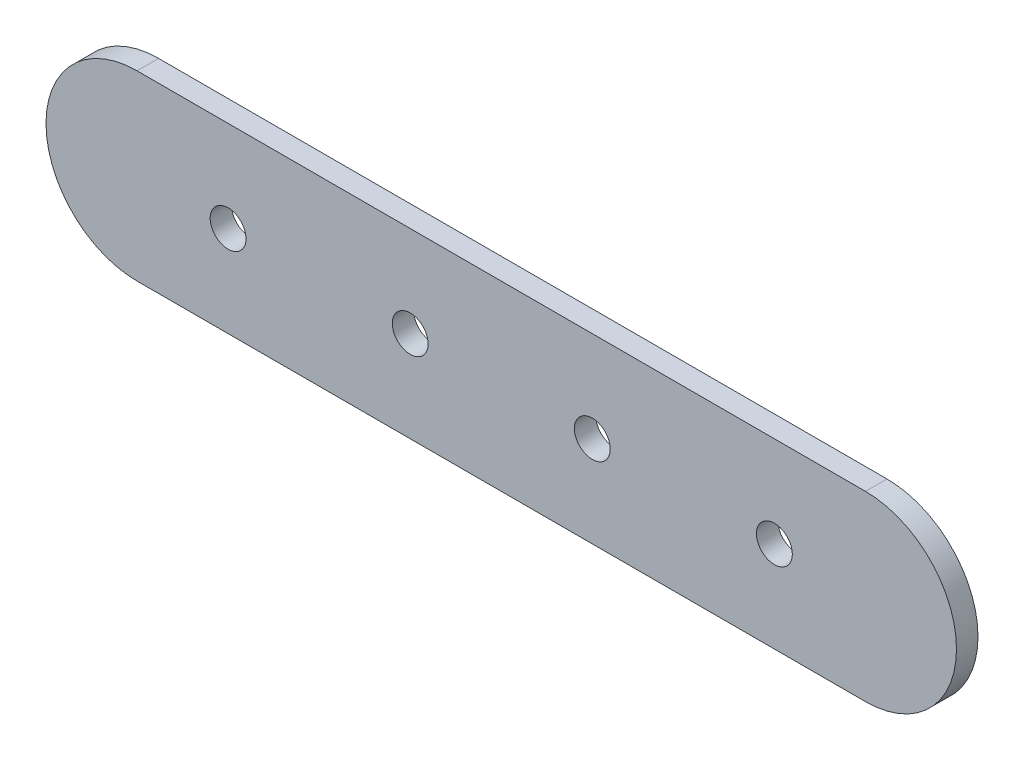
ISO-10303-21;
HEADER;
FILE_DESCRIPTION(('STEP AP214'),'2;1');
FILE_NAME('part.step','',(''),(''),'','','');
FILE_SCHEMA(('AUTOMOTIVE_DESIGN { 1 0 10303 214 1 1 1 1 }'));
ENDSEC;
DATA;
#1=APPLICATION_CONTEXT('core data for automotive mechanical design processes');
#2=APPLICATION_PROTOCOL_DEFINITION('international standard','automotive_design',2000,#1);
#3=PRODUCT_CONTEXT('',#1,'mechanical');
#4=PRODUCT('Part','Part','',(#3));
#5=PRODUCT_RELATED_PRODUCT_CATEGORY('part','',(#4));
#6=PRODUCT_DEFINITION_FORMATION('','',#4);
#7=PRODUCT_DEFINITION_CONTEXT('part definition',#1,'design');
#8=PRODUCT_DEFINITION('design','',#6,#7);
#9=PRODUCT_DEFINITION_SHAPE('','',#8);
#10=(LENGTH_UNIT() NAMED_UNIT(*) SI_UNIT(.MILLI.,.METRE.));
#11=(NAMED_UNIT(*) PLANE_ANGLE_UNIT() SI_UNIT($,.RADIAN.));
#12=(NAMED_UNIT(*) SI_UNIT($,.STERADIAN.) SOLID_ANGLE_UNIT());
#13=UNCERTAINTY_MEASURE_WITH_UNIT(LENGTH_MEASURE(1.E-05),#10,'distance_accuracy_value','');
#14=(GEOMETRIC_REPRESENTATION_CONTEXT(3) GLOBAL_UNCERTAINTY_ASSIGNED_CONTEXT((#13)) GLOBAL_UNIT_ASSIGNED_CONTEXT((#10,
#11,#12)) REPRESENTATION_CONTEXT('',''));
#15=CARTESIAN_POINT('',(0.,0.,0.));
#16=DIRECTION('',(0.,0.,1.));
#17=DIRECTION('',(1.,0.,0.));
#18=AXIS2_PLACEMENT_3D('',#15,#16,#17);
#19=CARTESIAN_POINT('',(-494.678321678322,0.,30.));
#20=DIRECTION('',(0.,0.,1.));
#21=DIRECTION('',(1.,0.,0.));
#22=AXIS2_PLACEMENT_3D('',#19,#20,#21);
#23=PLANE('',#22);
#24=CARTESIAN_POINT('',(140.321678321678,0.,30.));
#25=DIRECTION('',(0.,0.,1.));
#26=DIRECTION('',(1.,0.,0.));
#27=AXIS2_PLACEMENT_3D('',#24,#25,#26);
#28=CIRCLE('',#27,25.);
#29=CARTESIAN_POINT('',(165.321678321678,0.,30.));
#30=VERTEX_POINT('',#29);
#31=EDGE_CURVE('E142',#30,#30,#28,.T.);
#32=ORIENTED_EDGE('',*,*,#31,.F.);
#33=EDGE_LOOP('',(#32));
#34=FACE_BOUND('',#33,.T.);
#35=CARTESIAN_POINT('',(-367.678321678322,0.,30.));
#36=DIRECTION('',(0.,0.,1.));
#37=DIRECTION('',(1.,0.,0.));
#38=AXIS2_PLACEMENT_3D('',#35,#36,#37);
#39=CIRCLE('',#38,25.);
#40=CARTESIAN_POINT('',(-342.678321678322,0.,30.));
#41=VERTEX_POINT('',#40);
#42=EDGE_CURVE('E112',#41,#41,#39,.T.);
#43=ORIENTED_EDGE('',*,*,#42,.F.);
#44=EDGE_LOOP('',(#43));
#45=FACE_BOUND('',#44,.T.);
#46=CARTESIAN_POINT('',(-494.678321678322,0.,30.));
#47=DIRECTION('',(0.,0.,1.));
#48=DIRECTION('',(1.,0.,0.));
#49=AXIS2_PLACEMENT_3D('',#46,#47,#48);
#50=CIRCLE('',#49,127.);
#51=CARTESIAN_POINT('',(-494.678321678322,127.,30.));
#52=VERTEX_POINT('',#51);
#53=CARTESIAN_POINT('',(-494.678321678322,-127.,30.));
#54=VERTEX_POINT('',#53);
#55=EDGE_CURVE('E92',#52,#54,#50,.T.);
#56=ORIENTED_EDGE('',*,*,#55,.T.);
#57=DIRECTION('',(1.,0.,0.));
#58=VECTOR('',#57,1.);
#59=CARTESIAN_POINT('',(-494.678321678322,-127.,30.));
#60=LINE('',#59,#58);
#61=CARTESIAN_POINT('',(521.321678321678,-127.,30.));
#62=VERTEX_POINT('',#61);
#63=EDGE_CURVE('E87',#54,#62,#60,.T.);
#64=ORIENTED_EDGE('',*,*,#63,.T.);
#65=CARTESIAN_POINT('',(521.321678321678,0.,30.));
#66=DIRECTION('',(0.,0.,1.));
#67=DIRECTION('',(1.,0.,0.));
#68=AXIS2_PLACEMENT_3D('',#65,#66,#67);
#69=CIRCLE('',#68,127.);
#70=CARTESIAN_POINT('',(521.321678321678,127.,30.));
#71=VERTEX_POINT('',#70);
#72=EDGE_CURVE('E90',#62,#71,#69,.T.);
#73=ORIENTED_EDGE('',*,*,#72,.T.);
#74=DIRECTION('',(-1.,0.,0.));
#75=VECTOR('',#74,1.);
#76=CARTESIAN_POINT('',(-494.678321678322,127.,30.));
#77=LINE('',#76,#75);
#78=EDGE_CURVE('E57',#71,#52,#77,.T.);
#79=ORIENTED_EDGE('',*,*,#78,.T.);
#80=EDGE_LOOP('',(#56,#64,#73,#79));
#81=FACE_BOUND('',#80,.T.);
#82=CARTESIAN_POINT('',(-113.678321678322,0.,30.));
#83=DIRECTION('',(0.,0.,1.));
#84=DIRECTION('',(1.,0.,0.));
#85=AXIS2_PLACEMENT_3D('',#82,#83,#84);
#86=CIRCLE('',#85,25.);
#87=CARTESIAN_POINT('',(-88.6783216783217,0.,30.));
#88=VERTEX_POINT('',#87);
#89=EDGE_CURVE('E134',#88,#88,#86,.T.);
#90=ORIENTED_EDGE('',*,*,#89,.F.);
#91=EDGE_LOOP('',(#90));
#92=FACE_BOUND('',#91,.T.);
#93=CARTESIAN_POINT('',(394.321678321678,0.,30.));
#94=DIRECTION('',(0.,0.,1.));
#95=DIRECTION('',(1.,0.,0.));
#96=AXIS2_PLACEMENT_3D('',#93,#94,#95);
#97=CIRCLE('',#96,25.);
#98=CARTESIAN_POINT('',(419.321678321678,0.,30.));
#99=VERTEX_POINT('',#98);
#100=EDGE_CURVE('E150',#99,#99,#97,.T.);
#101=ORIENTED_EDGE('',*,*,#100,.F.);
#102=EDGE_LOOP('',(#101));
#103=FACE_BOUND('',#102,.T.);
#104=ADVANCED_FACE('F39',(#34,#45,#81,#92,#103),#23,.T.);
#105=CARTESIAN_POINT('',(-494.678321678322,0.,0.));
#106=DIRECTION('',(0.,0.,1.));
#107=DIRECTION('',(1.,0.,0.));
#108=AXIS2_PLACEMENT_3D('',#105,#106,#107);
#109=PLANE('',#108);
#110=CARTESIAN_POINT('',(-494.678321678322,0.,0.));
#111=DIRECTION('',(0.,0.,1.));
#112=DIRECTION('',(1.,0.,0.));
#113=AXIS2_PLACEMENT_3D('',#110,#111,#112);
#114=CIRCLE('',#113,127.);
#115=CARTESIAN_POINT('',(-494.678321678322,127.,0.));
#116=VERTEX_POINT('',#115);
#117=CARTESIAN_POINT('',(-494.678321678322,-127.,0.));
#118=VERTEX_POINT('',#117);
#119=EDGE_CURVE('E108',#116,#118,#114,.T.);
#120=ORIENTED_EDGE('',*,*,#119,.F.);
#121=DIRECTION('',(-1.,0.,0.));
#122=VECTOR('',#121,1.);
#123=CARTESIAN_POINT('',(-494.678321678322,127.,0.));
#124=LINE('',#123,#122);
#125=CARTESIAN_POINT('',(521.321678321678,127.,0.));
#126=VERTEX_POINT('',#125);
#127=EDGE_CURVE('E80',#126,#116,#124,.T.);
#128=ORIENTED_EDGE('',*,*,#127,.F.);
#129=CARTESIAN_POINT('',(521.321678321678,0.,0.));
#130=DIRECTION('',(0.,0.,1.));
#131=DIRECTION('',(1.,0.,0.));
#132=AXIS2_PLACEMENT_3D('',#129,#130,#131);
#133=CIRCLE('',#132,127.);
#134=CARTESIAN_POINT('',(521.321678321678,-127.,0.));
#135=VERTEX_POINT('',#134);
#136=EDGE_CURVE('E74',#135,#126,#133,.T.);
#137=ORIENTED_EDGE('',*,*,#136,.F.);
#138=DIRECTION('',(1.,0.,0.));
#139=VECTOR('',#138,1.);
#140=CARTESIAN_POINT('',(-494.678321678322,-127.,0.));
#141=LINE('',#140,#139);
#142=EDGE_CURVE('E97',#118,#135,#141,.T.);
#143=ORIENTED_EDGE('',*,*,#142,.F.);
#144=EDGE_LOOP('',(#120,#128,#137,#143));
#145=FACE_BOUND('',#144,.T.);
#146=CARTESIAN_POINT('',(-367.678321678322,0.,0.));
#147=DIRECTION('',(0.,0.,1.));
#148=DIRECTION('',(1.,0.,0.));
#149=AXIS2_PLACEMENT_3D('',#146,#147,#148);
#150=CIRCLE('',#149,25.);
#151=CARTESIAN_POINT('',(-342.678321678322,0.,0.));
#152=VERTEX_POINT('',#151);
#153=EDGE_CURVE('E130',#152,#152,#150,.T.);
#154=ORIENTED_EDGE('',*,*,#153,.T.);
#155=EDGE_LOOP('',(#154));
#156=FACE_BOUND('',#155,.T.);
#157=CARTESIAN_POINT('',(-113.678321678322,0.,0.));
#158=DIRECTION('',(0.,0.,1.));
#159=DIRECTION('',(1.,0.,0.));
#160=AXIS2_PLACEMENT_3D('',#157,#158,#159);
#161=CIRCLE('',#160,25.);
#162=CARTESIAN_POINT('',(-88.6783216783217,0.,0.));
#163=VERTEX_POINT('',#162);
#164=EDGE_CURVE('E138',#163,#163,#161,.T.);
#165=ORIENTED_EDGE('',*,*,#164,.T.);
#166=EDGE_LOOP('',(#165));
#167=FACE_BOUND('',#166,.T.);
#168=CARTESIAN_POINT('',(140.321678321678,0.,0.));
#169=DIRECTION('',(0.,0.,1.));
#170=DIRECTION('',(1.,0.,0.));
#171=AXIS2_PLACEMENT_3D('',#168,#169,#170);
#172=CIRCLE('',#171,25.);
#173=CARTESIAN_POINT('',(165.321678321678,0.,0.));
#174=VERTEX_POINT('',#173);
#175=EDGE_CURVE('E146',#174,#174,#172,.T.);
#176=ORIENTED_EDGE('',*,*,#175,.T.);
#177=EDGE_LOOP('',(#176));
#178=FACE_BOUND('',#177,.T.);
#179=CARTESIAN_POINT('',(394.321678321678,0.,0.));
#180=DIRECTION('',(0.,0.,1.));
#181=DIRECTION('',(1.,0.,0.));
#182=AXIS2_PLACEMENT_3D('',#179,#180,#181);
#183=CIRCLE('',#182,25.);
#184=CARTESIAN_POINT('',(419.321678321678,0.,0.));
#185=VERTEX_POINT('',#184);
#186=EDGE_CURVE('E154',#185,#185,#183,.T.);
#187=ORIENTED_EDGE('',*,*,#186,.T.);
#188=EDGE_LOOP('',(#187));
#189=FACE_BOUND('',#188,.T.);
#190=ADVANCED_FACE('F125',(#145,#156,#167,#178,#189),#109,.F.);
#191=CARTESIAN_POINT('',(-494.678321678322,0.,30.));
#192=DIRECTION('',(0.,0.,-1.));
#193=DIRECTION('',(-1.,0.,0.));
#194=AXIS2_PLACEMENT_3D('',#191,#192,#193);
#195=CYLINDRICAL_SURFACE('',#194,127.);
#196=ORIENTED_EDGE('',*,*,#119,.T.);
#197=DIRECTION('',(0.,0.,-1.));
#198=VECTOR('',#197,1.);
#199=CARTESIAN_POINT('',(-494.678321678322,-127.,30.));
#200=LINE('',#199,#198);
#201=EDGE_CURVE('E11',#54,#118,#200,.T.);
#202=ORIENTED_EDGE('',*,*,#201,.F.);
#203=ORIENTED_EDGE('',*,*,#55,.F.);
#204=DIRECTION('',(0.,0.,-1.));
#205=VECTOR('',#204,1.);
#206=CARTESIAN_POINT('',(-494.678321678322,127.,30.));
#207=LINE('',#206,#205);
#208=EDGE_CURVE('E104',#52,#116,#207,.T.);
#209=ORIENTED_EDGE('',*,*,#208,.T.);
#210=EDGE_LOOP('',(#196,#202,#203,#209));
#211=FACE_BOUND('',#210,.T.);
#212=ADVANCED_FACE('F41',(#211),#195,.T.);
#213=CARTESIAN_POINT('',(-494.678321678322,-127.,30.));
#214=DIRECTION('',(0.,1.,0.));
#215=DIRECTION('',(0.,0.,1.));
#216=AXIS2_PLACEMENT_3D('',#213,#214,#215);
#217=PLANE('',#216);
#218=ORIENTED_EDGE('',*,*,#142,.T.);
#219=DIRECTION('',(0.,0.,-1.));
#220=VECTOR('',#219,1.);
#221=CARTESIAN_POINT('',(521.321678321678,-127.,30.));
#222=LINE('',#221,#220);
#223=EDGE_CURVE('E49',#62,#135,#222,.T.);
#224=ORIENTED_EDGE('',*,*,#223,.F.);
#225=ORIENTED_EDGE('',*,*,#63,.F.);
#226=ORIENTED_EDGE('',*,*,#201,.T.);
#227=EDGE_LOOP('',(#218,#224,#225,#226));
#228=FACE_BOUND('',#227,.T.);
#229=ADVANCED_FACE('F96',(#228),#217,.F.);
#230=CARTESIAN_POINT('',(521.321678321678,0.,30.));
#231=DIRECTION('',(0.,0.,-1.));
#232=DIRECTION('',(-1.,0.,0.));
#233=AXIS2_PLACEMENT_3D('',#230,#231,#232);
#234=CYLINDRICAL_SURFACE('',#233,127.);
#235=ORIENTED_EDGE('',*,*,#136,.T.);
#236=DIRECTION('',(0.,0.,-1.));
#237=VECTOR('',#236,1.);
#238=CARTESIAN_POINT('',(521.321678321678,127.,30.));
#239=LINE('',#238,#237);
#240=EDGE_CURVE('E99',#71,#126,#239,.T.);
#241=ORIENTED_EDGE('',*,*,#240,.F.);
#242=ORIENTED_EDGE('',*,*,#72,.F.);
#243=ORIENTED_EDGE('',*,*,#223,.T.);
#244=EDGE_LOOP('',(#235,#241,#242,#243));
#245=FACE_BOUND('',#244,.T.);
#246=ADVANCED_FACE('F100',(#245),#234,.T.);
#247=CARTESIAN_POINT('',(-494.678321678322,127.,30.));
#248=DIRECTION('',(0.,-1.,0.));
#249=DIRECTION('',(0.,0.,-1.));
#250=AXIS2_PLACEMENT_3D('',#247,#248,#249);
#251=PLANE('',#250);
#252=ORIENTED_EDGE('',*,*,#127,.T.);
#253=ORIENTED_EDGE('',*,*,#208,.F.);
#254=ORIENTED_EDGE('',*,*,#78,.F.);
#255=ORIENTED_EDGE('',*,*,#240,.T.);
#256=EDGE_LOOP('',(#252,#253,#254,#255));
#257=FACE_BOUND('',#256,.T.);
#258=ADVANCED_FACE('F122',(#257),#251,.F.);
#259=CARTESIAN_POINT('',(-367.678321678322,0.,30.));
#260=DIRECTION('',(0.,0.,-1.));
#261=DIRECTION('',(-1.,0.,0.));
#262=AXIS2_PLACEMENT_3D('',#259,#260,#261);
#263=CYLINDRICAL_SURFACE('',#262,25.);
#264=ORIENTED_EDGE('',*,*,#42,.T.);
#265=EDGE_LOOP('',(#264));
#266=FACE_BOUND('',#265,.T.);
#267=ORIENTED_EDGE('',*,*,#153,.F.);
#268=EDGE_LOOP('',(#267));
#269=FACE_BOUND('',#268,.T.);
#270=ADVANCED_FACE('F175',(#266,#269),#263,.F.);
#271=CARTESIAN_POINT('',(-113.678321678322,0.,30.));
#272=DIRECTION('',(0.,0.,-1.));
#273=DIRECTION('',(-1.,0.,0.));
#274=AXIS2_PLACEMENT_3D('',#271,#272,#273);
#275=CYLINDRICAL_SURFACE('',#274,25.);
#276=ORIENTED_EDGE('',*,*,#89,.T.);
#277=EDGE_LOOP('',(#276));
#278=FACE_BOUND('',#277,.T.);
#279=ORIENTED_EDGE('',*,*,#164,.F.);
#280=EDGE_LOOP('',(#279));
#281=FACE_BOUND('',#280,.T.);
#282=ADVANCED_FACE('F221',(#278,#281),#275,.F.);
#283=CARTESIAN_POINT('',(140.321678321678,0.,30.));
#284=DIRECTION('',(0.,0.,-1.));
#285=DIRECTION('',(-1.,0.,0.));
#286=AXIS2_PLACEMENT_3D('',#283,#284,#285);
#287=CYLINDRICAL_SURFACE('',#286,25.);
#288=ORIENTED_EDGE('',*,*,#31,.T.);
#289=EDGE_LOOP('',(#288));
#290=FACE_BOUND('',#289,.T.);
#291=ORIENTED_EDGE('',*,*,#175,.F.);
#292=EDGE_LOOP('',(#291));
#293=FACE_BOUND('',#292,.T.);
#294=ADVANCED_FACE('F229',(#290,#293),#287,.F.);
#295=CARTESIAN_POINT('',(394.321678321678,0.,30.));
#296=DIRECTION('',(0.,0.,-1.));
#297=DIRECTION('',(-1.,0.,0.));
#298=AXIS2_PLACEMENT_3D('',#295,#296,#297);
#299=CYLINDRICAL_SURFACE('',#298,25.);
#300=ORIENTED_EDGE('',*,*,#100,.T.);
#301=EDGE_LOOP('',(#300));
#302=FACE_BOUND('',#301,.T.);
#303=ORIENTED_EDGE('',*,*,#186,.F.);
#304=EDGE_LOOP('',(#303));
#305=FACE_BOUND('',#304,.T.);
#306=ADVANCED_FACE('F162',(#302,#305),#299,.F.);
#307=CLOSED_SHELL('',(#104,#190,#212,#229,#246,#258,#270,#282,#294,#306));
#308=MANIFOLD_SOLID_BREP('B2',#307);
#309=ADVANCED_BREP_SHAPE_REPRESENTATION('',(#18,#308),#14);
#310=SHAPE_DEFINITION_REPRESENTATION(#9,#309);
ENDSEC;
END-ISO-10303-21;
